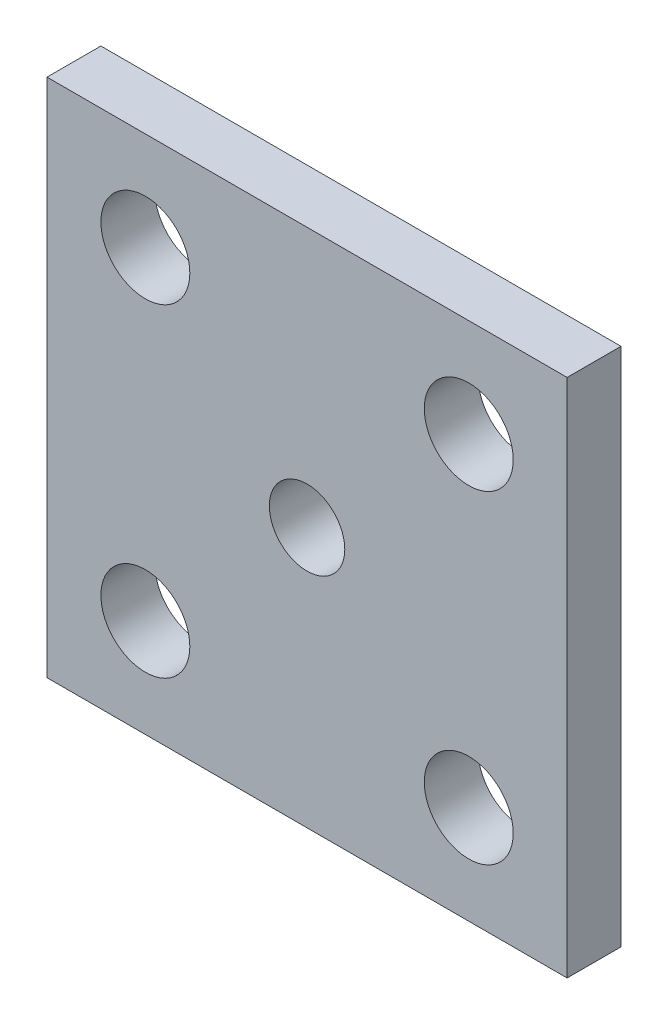
ISO-10303-21;
HEADER;
FILE_DESCRIPTION(('STEP AP214'),'2;1');
FILE_NAME('part.step','',(''),(''),'','','');
FILE_SCHEMA(('AUTOMOTIVE_DESIGN { 1 0 10303 214 1 1 1 1 }'));
ENDSEC;
DATA;
#1=APPLICATION_CONTEXT('core data for automotive mechanical design processes');
#2=APPLICATION_PROTOCOL_DEFINITION('international standard','automotive_design',2000,#1);
#3=PRODUCT_CONTEXT('',#1,'mechanical');
#4=PRODUCT('Part','Part','',(#3));
#5=PRODUCT_RELATED_PRODUCT_CATEGORY('part','',(#4));
#6=PRODUCT_DEFINITION_FORMATION('','',#4);
#7=PRODUCT_DEFINITION_CONTEXT('part definition',#1,'design');
#8=PRODUCT_DEFINITION('design','',#6,#7);
#9=PRODUCT_DEFINITION_SHAPE('','',#8);
#10=(LENGTH_UNIT() NAMED_UNIT(*) SI_UNIT(.MILLI.,.METRE.));
#11=(NAMED_UNIT(*) PLANE_ANGLE_UNIT() SI_UNIT($,.RADIAN.));
#12=(NAMED_UNIT(*) SI_UNIT($,.STERADIAN.) SOLID_ANGLE_UNIT());
#13=UNCERTAINTY_MEASURE_WITH_UNIT(LENGTH_MEASURE(1.E-05),#10,'distance_accuracy_value','');
#14=(GEOMETRIC_REPRESENTATION_CONTEXT(3) GLOBAL_UNCERTAINTY_ASSIGNED_CONTEXT((#13)) GLOBAL_UNIT_ASSIGNED_CONTEXT((#10,
#11,#12)) REPRESENTATION_CONTEXT('',''));
#15=CARTESIAN_POINT('',(0.,0.,0.));
#16=DIRECTION('',(0.,0.,1.));
#17=DIRECTION('',(1.,0.,0.));
#18=AXIS2_PLACEMENT_3D('',#15,#16,#17);
#19=CARTESIAN_POINT('',(0.,0.,5.));
#20=DIRECTION('',(0.,1.,0.));
#21=DIRECTION('',(0.,0.,1.));
#22=AXIS2_PLACEMENT_3D('',#19,#20,#21);
#23=PLANE('',#22);
#24=DIRECTION('',(1.,0.,0.));
#25=VECTOR('',#24,1.);
#26=CARTESIAN_POINT('',(0.,0.,0.));
#27=LINE('',#26,#25);
#28=CARTESIAN_POINT('',(0.,0.,0.));
#29=VERTEX_POINT('',#28);
#30=CARTESIAN_POINT('',(48.25,0.,0.));
#31=VERTEX_POINT('',#30);
#32=EDGE_CURVE('E115',#29,#31,#27,.T.);
#33=ORIENTED_EDGE('',*,*,#32,.T.);
#34=DIRECTION('',(0.,0.,-1.));
#35=VECTOR('',#34,1.);
#36=CARTESIAN_POINT('',(48.25,0.,5.));
#37=LINE('',#36,#35);
#38=CARTESIAN_POINT('',(48.25,0.,5.));
#39=VERTEX_POINT('',#38);
#40=EDGE_CURVE('E11',#39,#31,#37,.T.);
#41=ORIENTED_EDGE('',*,*,#40,.F.);
#42=DIRECTION('',(1.,0.,0.));
#43=VECTOR('',#42,1.);
#44=CARTESIAN_POINT('',(0.,0.,5.));
#45=LINE('',#44,#43);
#46=CARTESIAN_POINT('',(0.,0.,5.));
#47=VERTEX_POINT('',#46);
#48=EDGE_CURVE('E86',#47,#39,#45,.T.);
#49=ORIENTED_EDGE('',*,*,#48,.F.);
#50=DIRECTION('',(0.,0.,-1.));
#51=VECTOR('',#50,1.);
#52=CARTESIAN_POINT('',(0.,0.,5.));
#53=LINE('',#52,#51);
#54=EDGE_CURVE('E52',#47,#29,#53,.T.);
#55=ORIENTED_EDGE('',*,*,#54,.T.);
#56=EDGE_LOOP('',(#33,#41,#49,#55));
#57=FACE_BOUND('',#56,.T.);
#58=ADVANCED_FACE('F35',(#57),#23,.F.);
#59=CARTESIAN_POINT('',(48.25,0.,5.));
#60=DIRECTION('',(-1.,0.,0.));
#61=DIRECTION('',(0.,-1.,0.));
#62=AXIS2_PLACEMENT_3D('',#59,#60,#61);
#63=PLANE('',#62);
#64=DIRECTION('',(0.,1.,0.));
#65=VECTOR('',#64,1.);
#66=CARTESIAN_POINT('',(48.25,0.,0.));
#67=LINE('',#66,#65);
#68=CARTESIAN_POINT('',(48.25,48.25,0.));
#69=VERTEX_POINT('',#68);
#70=EDGE_CURVE('E91',#31,#69,#67,.T.);
#71=ORIENTED_EDGE('',*,*,#70,.T.);
#72=DIRECTION('',(0.,0.,-1.));
#73=VECTOR('',#72,1.);
#74=CARTESIAN_POINT('',(48.25,48.25,5.));
#75=LINE('',#74,#73);
#76=CARTESIAN_POINT('',(48.25,48.25,5.));
#77=VERTEX_POINT('',#76);
#78=EDGE_CURVE('E44',#77,#69,#75,.T.);
#79=ORIENTED_EDGE('',*,*,#78,.F.);
#80=DIRECTION('',(0.,1.,0.));
#81=VECTOR('',#80,1.);
#82=CARTESIAN_POINT('',(48.25,0.,5.));
#83=LINE('',#82,#81);
#84=EDGE_CURVE('E77',#39,#77,#83,.T.);
#85=ORIENTED_EDGE('',*,*,#84,.F.);
#86=ORIENTED_EDGE('',*,*,#40,.T.);
#87=EDGE_LOOP('',(#71,#79,#85,#86));
#88=FACE_BOUND('',#87,.T.);
#89=ADVANCED_FACE('F90',(#88),#63,.F.);
#90=CARTESIAN_POINT('',(0.,48.25,5.));
#91=DIRECTION('',(0.,1.,0.));
#92=DIRECTION('',(0.,0.,1.));
#93=AXIS2_PLACEMENT_3D('',#90,#91,#92);
#94=PLANE('',#93);
#95=DIRECTION('',(1.,0.,0.));
#96=VECTOR('',#95,1.);
#97=CARTESIAN_POINT('',(0.,48.25,0.));
#98=LINE('',#97,#96);
#99=CARTESIAN_POINT('',(0.,48.25,0.));
#100=VERTEX_POINT('',#99);
#101=EDGE_CURVE('E118',#100,#69,#98,.T.);
#102=ORIENTED_EDGE('',*,*,#101,.F.);
#103=DIRECTION('',(0.,0.,-1.));
#104=VECTOR('',#103,1.);
#105=CARTESIAN_POINT('',(0.,48.25,5.));
#106=LINE('',#105,#104);
#107=CARTESIAN_POINT('',(0.,48.25,5.));
#108=VERTEX_POINT('',#107);
#109=EDGE_CURVE('E66',#108,#100,#106,.T.);
#110=ORIENTED_EDGE('',*,*,#109,.F.);
#111=DIRECTION('',(1.,0.,0.));
#112=VECTOR('',#111,1.);
#113=CARTESIAN_POINT('',(0.,48.25,5.));
#114=LINE('',#113,#112);
#115=EDGE_CURVE('E85',#108,#77,#114,.T.);
#116=ORIENTED_EDGE('',*,*,#115,.T.);
#117=ORIENTED_EDGE('',*,*,#78,.T.);
#118=EDGE_LOOP('',(#102,#110,#116,#117));
#119=FACE_BOUND('',#118,.T.);
#120=ADVANCED_FACE('F94',(#119),#94,.T.);
#121=CARTESIAN_POINT('',(9.125,9.12500000000001,5.));
#122=DIRECTION('',(0.,0.,-1.));
#123=DIRECTION('',(-1.,0.,0.));
#124=AXIS2_PLACEMENT_3D('',#121,#122,#123);
#125=CYLINDRICAL_SURFACE('',#124,4.125);
#126=CARTESIAN_POINT('',(9.125,9.12500000000001,5.));
#127=DIRECTION('',(0.,0.,1.));
#128=DIRECTION('',(1.,0.,0.));
#129=AXIS2_PLACEMENT_3D('',#126,#127,#128);
#130=CIRCLE('',#129,4.125);
#131=CARTESIAN_POINT('',(13.25,9.12500000000001,5.));
#132=VERTEX_POINT('',#131);
#133=EDGE_CURVE('E103',#132,#132,#130,.T.);
#134=ORIENTED_EDGE('',*,*,#133,.T.);
#135=EDGE_LOOP('',(#134));
#136=FACE_BOUND('',#135,.T.);
#137=CARTESIAN_POINT('',(9.125,9.12500000000001,0.));
#138=DIRECTION('',(0.,0.,1.));
#139=DIRECTION('',(1.,0.,0.));
#140=AXIS2_PLACEMENT_3D('',#137,#138,#139);
#141=CIRCLE('',#140,4.125);
#142=CARTESIAN_POINT('',(13.25,9.12500000000001,0.));
#143=VERTEX_POINT('',#142);
#144=EDGE_CURVE('E126',#143,#143,#141,.T.);
#145=ORIENTED_EDGE('',*,*,#144,.F.);
#146=EDGE_LOOP('',(#145));
#147=FACE_BOUND('',#146,.T.);
#148=ADVANCED_FACE('F179',(#136,#147),#125,.F.);
#149=CARTESIAN_POINT('',(39.125,39.125,5.));
#150=DIRECTION('',(0.,0.,-1.));
#151=DIRECTION('',(-1.,0.,0.));
#152=AXIS2_PLACEMENT_3D('',#149,#150,#151);
#153=CYLINDRICAL_SURFACE('',#152,4.12499999999999);
#154=CARTESIAN_POINT('',(39.125,39.125,5.));
#155=DIRECTION('',(0.,0.,1.));
#156=DIRECTION('',(1.,0.,0.));
#157=AXIS2_PLACEMENT_3D('',#154,#155,#156);
#158=CIRCLE('',#157,4.12499999999999);
#159=CARTESIAN_POINT('',(43.25,39.125,5.));
#160=VERTEX_POINT('',#159);
#161=EDGE_CURVE('E97',#160,#160,#158,.T.);
#162=ORIENTED_EDGE('',*,*,#161,.T.);
#163=EDGE_LOOP('',(#162));
#164=FACE_BOUND('',#163,.T.);
#165=CARTESIAN_POINT('',(39.125,39.125,0.));
#166=DIRECTION('',(0.,0.,1.));
#167=DIRECTION('',(1.,0.,0.));
#168=AXIS2_PLACEMENT_3D('',#165,#166,#167);
#169=CIRCLE('',#168,4.12499999999999);
#170=CARTESIAN_POINT('',(43.25,39.125,0.));
#171=VERTEX_POINT('',#170);
#172=EDGE_CURVE('E123',#171,#171,#169,.T.);
#173=ORIENTED_EDGE('',*,*,#172,.F.);
#174=EDGE_LOOP('',(#173));
#175=FACE_BOUND('',#174,.T.);
#176=ADVANCED_FACE('F174',(#164,#175),#153,.F.);
#177=CARTESIAN_POINT('',(0.,0.,5.));
#178=DIRECTION('',(-1.,0.,0.));
#179=DIRECTION('',(0.,-1.,0.));
#180=AXIS2_PLACEMENT_3D('',#177,#178,#179);
#181=PLANE('',#180);
#182=DIRECTION('',(0.,1.,0.));
#183=VECTOR('',#182,1.);
#184=CARTESIAN_POINT('',(0.,0.,0.));
#185=LINE('',#184,#183);
#186=EDGE_CURVE('E120',#29,#100,#185,.T.);
#187=ORIENTED_EDGE('',*,*,#186,.F.);
#188=ORIENTED_EDGE('',*,*,#54,.F.);
#189=DIRECTION('',(0.,1.,0.));
#190=VECTOR('',#189,1.);
#191=CARTESIAN_POINT('',(0.,0.,5.));
#192=LINE('',#191,#190);
#193=EDGE_CURVE('E95',#47,#108,#192,.T.);
#194=ORIENTED_EDGE('',*,*,#193,.T.);
#195=ORIENTED_EDGE('',*,*,#109,.T.);
#196=EDGE_LOOP('',(#187,#188,#194,#195));
#197=FACE_BOUND('',#196,.T.);
#198=ADVANCED_FACE('F168',(#197),#181,.T.);
#199=CARTESIAN_POINT('',(24.125,24.125,5.));
#200=DIRECTION('',(0.,0.,-1.));
#201=DIRECTION('',(-1.,0.,0.));
#202=AXIS2_PLACEMENT_3D('',#199,#200,#201);
#203=CYLINDRICAL_SURFACE('',#202,3.5);
#204=CARTESIAN_POINT('',(24.125,24.125,5.));
#205=DIRECTION('',(0.,0.,1.));
#206=DIRECTION('',(1.,0.,0.));
#207=AXIS2_PLACEMENT_3D('',#204,#205,#206);
#208=CIRCLE('',#207,3.5);
#209=CARTESIAN_POINT('',(27.625,24.125,5.));
#210=VERTEX_POINT('',#209);
#211=EDGE_CURVE('E137',#210,#210,#208,.T.);
#212=ORIENTED_EDGE('',*,*,#211,.T.);
#213=EDGE_LOOP('',(#212));
#214=FACE_BOUND('',#213,.T.);
#215=CARTESIAN_POINT('',(24.125,24.125,0.));
#216=DIRECTION('',(0.,0.,1.));
#217=DIRECTION('',(1.,0.,0.));
#218=AXIS2_PLACEMENT_3D('',#215,#216,#217);
#219=CIRCLE('',#218,3.5);
#220=CARTESIAN_POINT('',(27.625,24.125,0.));
#221=VERTEX_POINT('',#220);
#222=EDGE_CURVE('E112',#221,#221,#219,.T.);
#223=ORIENTED_EDGE('',*,*,#222,.F.);
#224=EDGE_LOOP('',(#223));
#225=FACE_BOUND('',#224,.T.);
#226=ADVANCED_FACE('F145',(#214,#225),#203,.F.);
#227=CARTESIAN_POINT('',(9.125,39.125,5.));
#228=DIRECTION('',(0.,0.,-1.));
#229=DIRECTION('',(-1.,0.,0.));
#230=AXIS2_PLACEMENT_3D('',#227,#228,#229);
#231=CYLINDRICAL_SURFACE('',#230,4.125);
#232=CARTESIAN_POINT('',(9.125,39.125,5.));
#233=DIRECTION('',(0.,0.,1.));
#234=DIRECTION('',(1.,0.,0.));
#235=AXIS2_PLACEMENT_3D('',#232,#233,#234);
#236=CIRCLE('',#235,4.125);
#237=CARTESIAN_POINT('',(13.25,39.125,5.));
#238=VERTEX_POINT('',#237);
#239=EDGE_CURVE('E132',#238,#238,#236,.F.);
#240=ORIENTED_EDGE('',*,*,#239,.F.);
#241=EDGE_LOOP('',(#240));
#242=FACE_BOUND('',#241,.T.);
#243=CARTESIAN_POINT('',(9.125,39.125,0.));
#244=DIRECTION('',(0.,0.,1.));
#245=DIRECTION('',(1.,0.,0.));
#246=AXIS2_PLACEMENT_3D('',#243,#244,#245);
#247=CIRCLE('',#246,4.125);
#248=CARTESIAN_POINT('',(13.25,39.125,0.));
#249=VERTEX_POINT('',#248);
#250=EDGE_CURVE('E109',#249,#249,#247,.F.);
#251=ORIENTED_EDGE('',*,*,#250,.T.);
#252=EDGE_LOOP('',(#251));
#253=FACE_BOUND('',#252,.T.);
#254=ADVANCED_FACE('F37',(#242,#253),#231,.F.);
#255=CARTESIAN_POINT('',(39.125,9.12500000000001,5.));
#256=DIRECTION('',(0.,0.,-1.));
#257=DIRECTION('',(-1.,0.,0.));
#258=AXIS2_PLACEMENT_3D('',#255,#256,#257);
#259=CYLINDRICAL_SURFACE('',#258,4.12499999999998);
#260=CARTESIAN_POINT('',(39.125,9.12500000000001,5.));
#261=DIRECTION('',(0.,0.,1.));
#262=DIRECTION('',(1.,0.,0.));
#263=AXIS2_PLACEMENT_3D('',#260,#261,#262);
#264=CIRCLE('',#263,4.12499999999998);
#265=CARTESIAN_POINT('',(43.25,9.12500000000001,5.));
#266=VERTEX_POINT('',#265);
#267=EDGE_CURVE('E106',#266,#266,#264,.F.);
#268=ORIENTED_EDGE('',*,*,#267,.F.);
#269=EDGE_LOOP('',(#268));
#270=FACE_BOUND('',#269,.T.);
#271=CARTESIAN_POINT('',(39.125,9.12500000000001,0.));
#272=DIRECTION('',(0.,0.,1.));
#273=DIRECTION('',(1.,0.,0.));
#274=AXIS2_PLACEMENT_3D('',#271,#272,#273);
#275=CIRCLE('',#274,4.12499999999998);
#276=CARTESIAN_POINT('',(43.25,9.12500000000001,0.));
#277=VERTEX_POINT('',#276);
#278=EDGE_CURVE('E129',#277,#277,#275,.F.);
#279=ORIENTED_EDGE('',*,*,#278,.T.);
#280=EDGE_LOOP('',(#279));
#281=FACE_BOUND('',#280,.T.);
#282=ADVANCED_FACE('F150',(#270,#281),#259,.F.);
#283=CARTESIAN_POINT('',(0.,0.,5.));
#284=DIRECTION('',(0.,0.,1.));
#285=DIRECTION('',(1.,0.,0.));
#286=AXIS2_PLACEMENT_3D('',#283,#284,#285);
#287=PLANE('',#286);
#288=ORIENTED_EDGE('',*,*,#239,.T.);
#289=EDGE_LOOP('',(#288));
#290=FACE_BOUND('',#289,.T.);
#291=ORIENTED_EDGE('',*,*,#211,.F.);
#292=EDGE_LOOP('',(#291));
#293=FACE_BOUND('',#292,.T.);
#294=ORIENTED_EDGE('',*,*,#48,.T.);
#295=ORIENTED_EDGE('',*,*,#84,.T.);
#296=ORIENTED_EDGE('',*,*,#115,.F.);
#297=ORIENTED_EDGE('',*,*,#193,.F.);
#298=EDGE_LOOP('',(#294,#295,#296,#297));
#299=FACE_BOUND('',#298,.T.);
#300=ORIENTED_EDGE('',*,*,#161,.F.);
#301=EDGE_LOOP('',(#300));
#302=FACE_BOUND('',#301,.T.);
#303=ORIENTED_EDGE('',*,*,#133,.F.);
#304=EDGE_LOOP('',(#303));
#305=FACE_BOUND('',#304,.T.);
#306=ORIENTED_EDGE('',*,*,#267,.T.);
#307=EDGE_LOOP('',(#306));
#308=FACE_BOUND('',#307,.T.);
#309=ADVANCED_FACE('F81',(#290,#293,#299,#302,#305,#308),#287,.T.);
#310=CARTESIAN_POINT('',(0.,0.,0.));
#311=DIRECTION('',(0.,0.,1.));
#312=DIRECTION('',(1.,0.,0.));
#313=AXIS2_PLACEMENT_3D('',#310,#311,#312);
#314=PLANE('',#313);
#315=ORIENTED_EDGE('',*,*,#250,.F.);
#316=EDGE_LOOP('',(#315));
#317=FACE_BOUND('',#316,.T.);
#318=ORIENTED_EDGE('',*,*,#222,.T.);
#319=EDGE_LOOP('',(#318));
#320=FACE_BOUND('',#319,.T.);
#321=ORIENTED_EDGE('',*,*,#32,.F.);
#322=ORIENTED_EDGE('',*,*,#186,.T.);
#323=ORIENTED_EDGE('',*,*,#101,.T.);
#324=ORIENTED_EDGE('',*,*,#70,.F.);
#325=EDGE_LOOP('',(#321,#322,#323,#324));
#326=FACE_BOUND('',#325,.T.);
#327=ORIENTED_EDGE('',*,*,#172,.T.);
#328=EDGE_LOOP('',(#327));
#329=FACE_BOUND('',#328,.T.);
#330=ORIENTED_EDGE('',*,*,#144,.T.);
#331=EDGE_LOOP('',(#330));
#332=FACE_BOUND('',#331,.T.);
#333=ORIENTED_EDGE('',*,*,#278,.F.);
#334=EDGE_LOOP('',(#333));
#335=FACE_BOUND('',#334,.T.);
#336=ADVANCED_FACE('F149',(#317,#320,#326,#329,#332,#335),#314,.F.);
#337=CLOSED_SHELL('',(#58,#89,#120,#148,#176,#198,#226,#254,#282,#309,#336));
#338=MANIFOLD_SOLID_BREP('B2',#337);
#339=ADVANCED_BREP_SHAPE_REPRESENTATION('',(#18,#338),#14);
#340=SHAPE_DEFINITION_REPRESENTATION(#9,#339);
ENDSEC;
END-ISO-10303-21;
